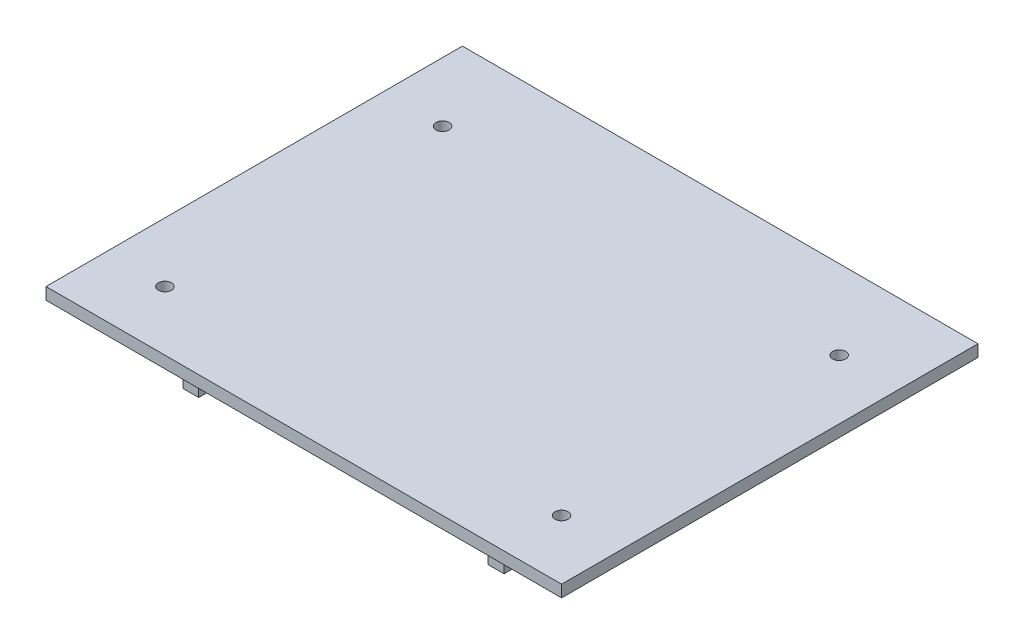
ISO-10303-21;
HEADER;
FILE_DESCRIPTION(('STEP AP214'),'2;1');
FILE_NAME('part.step','',(''),(''),'','','');
FILE_SCHEMA(('AUTOMOTIVE_DESIGN { 1 0 10303 214 1 1 1 1 }'));
ENDSEC;
DATA;
#1=APPLICATION_CONTEXT('core data for automotive mechanical design processes');
#2=APPLICATION_PROTOCOL_DEFINITION('international standard','automotive_design',2000,#1);
#3=PRODUCT_CONTEXT('',#1,'mechanical');
#4=PRODUCT('Part','Part','',(#3));
#5=PRODUCT_RELATED_PRODUCT_CATEGORY('part','',(#4));
#6=PRODUCT_DEFINITION_FORMATION('','',#4);
#7=PRODUCT_DEFINITION_CONTEXT('part definition',#1,'design');
#8=PRODUCT_DEFINITION('design','',#6,#7);
#9=PRODUCT_DEFINITION_SHAPE('','',#8);
#10=(LENGTH_UNIT() NAMED_UNIT(*) SI_UNIT(.MILLI.,.METRE.));
#11=(NAMED_UNIT(*) PLANE_ANGLE_UNIT() SI_UNIT($,.RADIAN.));
#12=(NAMED_UNIT(*) SI_UNIT($,.STERADIAN.) SOLID_ANGLE_UNIT());
#13=UNCERTAINTY_MEASURE_WITH_UNIT(LENGTH_MEASURE(1.E-05),#10,'distance_accuracy_value','');
#14=(GEOMETRIC_REPRESENTATION_CONTEXT(3) GLOBAL_UNCERTAINTY_ASSIGNED_CONTEXT((#13)) GLOBAL_UNIT_ASSIGNED_CONTEXT((#10,
#11,#12)) REPRESENTATION_CONTEXT('',''));
#15=CARTESIAN_POINT('',(0.,0.,0.));
#16=DIRECTION('',(0.,0.,1.));
#17=DIRECTION('',(1.,0.,0.));
#18=AXIS2_PLACEMENT_3D('',#15,#16,#17);
#19=CARTESIAN_POINT('',(-65.,3.,-12.));
#20=DIRECTION('',(1.,0.,0.));
#21=DIRECTION('',(0.,0.,-1.));
#22=AXIS2_PLACEMENT_3D('',#19,#20,#21);
#23=PLANE('',#22);
#24=DIRECTION('',(0.,0.,1.));
#25=VECTOR('',#24,1.);
#26=CARTESIAN_POINT('',(-65.,0.,-12.));
#27=LINE('',#26,#25);
#28=CARTESIAN_POINT('',(-65.,0.,-12.));
#29=VERTEX_POINT('',#28);
#30=CARTESIAN_POINT('',(-65.,0.,93.));
#31=VERTEX_POINT('',#30);
#32=EDGE_CURVE('E293',#29,#31,#27,.T.);
#33=ORIENTED_EDGE('',*,*,#32,.T.);
#34=DIRECTION('',(0.,-1.,0.));
#35=VECTOR('',#34,1.);
#36=CARTESIAN_POINT('',(-65.,3.,93.));
#37=LINE('',#36,#35);
#38=CARTESIAN_POINT('',(-65.,3.,93.));
#39=VERTEX_POINT('',#38);
#40=EDGE_CURVE('E379',#39,#31,#37,.T.);
#41=ORIENTED_EDGE('',*,*,#40,.F.);
#42=DIRECTION('',(0.,0.,1.));
#43=VECTOR('',#42,1.);
#44=CARTESIAN_POINT('',(-65.,3.,-12.));
#45=LINE('',#44,#43);
#46=CARTESIAN_POINT('',(-65.,3.,-12.));
#47=VERTEX_POINT('',#46);
#48=EDGE_CURVE('E345',#47,#39,#45,.T.);
#49=ORIENTED_EDGE('',*,*,#48,.F.);
#50=DIRECTION('',(0.,-1.,0.));
#51=VECTOR('',#50,1.);
#52=CARTESIAN_POINT('',(-65.,3.,-12.));
#53=LINE('',#52,#51);
#54=EDGE_CURVE('E357',#47,#29,#53,.T.);
#55=ORIENTED_EDGE('',*,*,#54,.T.);
#56=EDGE_LOOP('',(#33,#41,#49,#55));
#57=FACE_BOUND('',#56,.T.);
#58=ADVANCED_FACE('F44',(#57),#23,.F.);
#59=CARTESIAN_POINT('',(-65.,3.,93.));
#60=DIRECTION('',(0.,0.,-1.));
#61=DIRECTION('',(-1.,0.,0.));
#62=AXIS2_PLACEMENT_3D('',#59,#60,#61);
#63=PLANE('',#62);
#64=DIRECTION('',(1.,0.,0.));
#65=VECTOR('',#64,1.);
#66=CARTESIAN_POINT('',(-65.,0.,93.));
#67=LINE('',#66,#65);
#68=CARTESIAN_POINT('',(65.,0.,93.));
#69=VERTEX_POINT('',#68);
#70=EDGE_CURVE('E363',#31,#69,#67,.T.);
#71=ORIENTED_EDGE('',*,*,#70,.T.);
#72=DIRECTION('',(0.,-1.,0.));
#73=VECTOR('',#72,1.);
#74=CARTESIAN_POINT('',(65.,3.,93.));
#75=LINE('',#74,#73);
#76=CARTESIAN_POINT('',(65.,3.,93.));
#77=VERTEX_POINT('',#76);
#78=EDGE_CURVE('E376',#77,#69,#75,.T.);
#79=ORIENTED_EDGE('',*,*,#78,.F.);
#80=DIRECTION('',(1.,0.,0.));
#81=VECTOR('',#80,1.);
#82=CARTESIAN_POINT('',(-65.,3.,93.));
#83=LINE('',#82,#81);
#84=EDGE_CURVE('E350',#39,#77,#83,.T.);
#85=ORIENTED_EDGE('',*,*,#84,.F.);
#86=ORIENTED_EDGE('',*,*,#40,.T.);
#87=EDGE_LOOP('',(#71,#79,#85,#86));
#88=FACE_BOUND('',#87,.T.);
#89=ADVANCED_FACE('F426',(#88),#63,.F.);
#90=CARTESIAN_POINT('',(65.,3.,-12.));
#91=DIRECTION('',(-1.,0.,0.));
#92=DIRECTION('',(0.,0.,1.));
#93=AXIS2_PLACEMENT_3D('',#90,#91,#92);
#94=PLANE('',#93);
#95=DIRECTION('',(0.,0.,-1.));
#96=VECTOR('',#95,1.);
#97=CARTESIAN_POINT('',(65.,0.,-12.));
#98=LINE('',#97,#96);
#99=CARTESIAN_POINT('',(65.,0.,-12.));
#100=VERTEX_POINT('',#99);
#101=EDGE_CURVE('E364',#69,#100,#98,.T.);
#102=ORIENTED_EDGE('',*,*,#101,.T.);
#103=DIRECTION('',(0.,-1.,0.));
#104=VECTOR('',#103,1.);
#105=CARTESIAN_POINT('',(65.,3.,-12.));
#106=LINE('',#105,#104);
#107=CARTESIAN_POINT('',(65.,3.,-12.));
#108=VERTEX_POINT('',#107);
#109=EDGE_CURVE('E375',#108,#100,#106,.T.);
#110=ORIENTED_EDGE('',*,*,#109,.F.);
#111=DIRECTION('',(0.,0.,-1.));
#112=VECTOR('',#111,1.);
#113=CARTESIAN_POINT('',(65.,3.,-12.));
#114=LINE('',#113,#112);
#115=EDGE_CURVE('E351',#77,#108,#114,.T.);
#116=ORIENTED_EDGE('',*,*,#115,.F.);
#117=ORIENTED_EDGE('',*,*,#78,.T.);
#118=EDGE_LOOP('',(#102,#110,#116,#117));
#119=FACE_BOUND('',#118,.T.);
#120=ADVANCED_FACE('F433',(#119),#94,.F.);
#121=CARTESIAN_POINT('',(-65.,3.,-12.));
#122=DIRECTION('',(0.,0.,1.));
#123=DIRECTION('',(1.,0.,0.));
#124=AXIS2_PLACEMENT_3D('',#121,#122,#123);
#125=PLANE('',#124);
#126=DIRECTION('',(-1.,0.,0.));
#127=VECTOR('',#126,1.);
#128=CARTESIAN_POINT('',(-65.,0.,-12.));
#129=LINE('',#128,#127);
#130=EDGE_CURVE('E348',#100,#29,#129,.T.);
#131=ORIENTED_EDGE('',*,*,#130,.T.);
#132=ORIENTED_EDGE('',*,*,#54,.F.);
#133=DIRECTION('',(-1.,0.,0.));
#134=VECTOR('',#133,1.);
#135=CARTESIAN_POINT('',(-65.,3.,-12.));
#136=LINE('',#135,#134);
#137=EDGE_CURVE('E353',#108,#47,#136,.T.);
#138=ORIENTED_EDGE('',*,*,#137,.F.);
#139=ORIENTED_EDGE('',*,*,#109,.T.);
#140=EDGE_LOOP('',(#131,#132,#138,#139));
#141=FACE_BOUND('',#140,.T.);
#142=ADVANCED_FACE('F446',(#141),#125,.F.);
#143=CARTESIAN_POINT('',(0.,3.,0.));
#144=DIRECTION('',(0.,1.,0.));
#145=DIRECTION('',(0.,0.,1.));
#146=AXIS2_PLACEMENT_3D('',#143,#144,#145);
#147=PLANE('',#146);
#148=CARTESIAN_POINT('',(-50.,3.,78.));
#149=DIRECTION('',(0.,1.,0.));
#150=DIRECTION('',(0.,0.,1.));
#151=AXIS2_PLACEMENT_3D('',#148,#149,#150);
#152=CIRCLE('',#151,1.65);
#153=CARTESIAN_POINT('',(-50.,3.,79.65));
#154=VERTEX_POINT('',#153);
#155=EDGE_CURVE('E557',#154,#154,#152,.T.);
#156=ORIENTED_EDGE('',*,*,#155,.F.);
#157=EDGE_LOOP('',(#156));
#158=FACE_BOUND('',#157,.T.);
#159=CARTESIAN_POINT('',(50.,3.,8.));
#160=DIRECTION('',(0.,1.,0.));
#161=DIRECTION('',(0.,0.,1.));
#162=AXIS2_PLACEMENT_3D('',#159,#160,#161);
#163=CIRCLE('',#162,1.65);
#164=CARTESIAN_POINT('',(50.,3.,9.65));
#165=VERTEX_POINT('',#164);
#166=EDGE_CURVE('E563',#165,#165,#163,.T.);
#167=ORIENTED_EDGE('',*,*,#166,.F.);
#168=EDGE_LOOP('',(#167));
#169=FACE_BOUND('',#168,.T.);
#170=CARTESIAN_POINT('',(50.,3.,78.));
#171=DIRECTION('',(0.,1.,0.));
#172=DIRECTION('',(0.,0.,1.));
#173=AXIS2_PLACEMENT_3D('',#170,#171,#172);
#174=CIRCLE('',#173,1.65);
#175=CARTESIAN_POINT('',(50.,3.,79.65));
#176=VERTEX_POINT('',#175);
#177=EDGE_CURVE('E780',#176,#176,#174,.T.);
#178=ORIENTED_EDGE('',*,*,#177,.F.);
#179=EDGE_LOOP('',(#178));
#180=FACE_BOUND('',#179,.T.);
#181=CARTESIAN_POINT('',(-50.,3.,8.));
#182=DIRECTION('',(0.,1.,0.));
#183=DIRECTION('',(0.,0.,1.));
#184=AXIS2_PLACEMENT_3D('',#181,#182,#183);
#185=CIRCLE('',#184,1.65);
#186=CARTESIAN_POINT('',(-50.,3.,9.65));
#187=VERTEX_POINT('',#186);
#188=EDGE_CURVE('E400',#187,#187,#185,.T.);
#189=ORIENTED_EDGE('',*,*,#188,.F.);
#190=EDGE_LOOP('',(#189));
#191=FACE_BOUND('',#190,.T.);
#192=ORIENTED_EDGE('',*,*,#48,.T.);
#193=ORIENTED_EDGE('',*,*,#84,.T.);
#194=ORIENTED_EDGE('',*,*,#115,.T.);
#195=ORIENTED_EDGE('',*,*,#137,.T.);
#196=EDGE_LOOP('',(#192,#193,#194,#195));
#197=FACE_BOUND('',#196,.T.);
#198=ADVANCED_FACE('F444',(#158,#169,#180,#191,#197),#147,.T.);
#199=CARTESIAN_POINT('',(0.,0.,0.));
#200=DIRECTION('',(0.,1.,0.));
#201=DIRECTION('',(0.,0.,1.));
#202=AXIS2_PLACEMENT_3D('',#199,#200,#201);
#203=PLANE('',#202);
#204=CARTESIAN_POINT('',(-50.,0.,78.));
#205=DIRECTION('',(0.,1.,0.));
#206=DIRECTION('',(0.,0.,1.));
#207=AXIS2_PLACEMENT_3D('',#204,#205,#206);
#208=CIRCLE('',#207,1.65);
#209=CARTESIAN_POINT('',(-50.,0.,79.65));
#210=VERTEX_POINT('',#209);
#211=EDGE_CURVE('E48',#210,#210,#208,.T.);
#212=ORIENTED_EDGE('',*,*,#211,.T.);
#213=EDGE_LOOP('',(#212));
#214=FACE_BOUND('',#213,.T.);
#215=CARTESIAN_POINT('',(50.,0.,8.));
#216=DIRECTION('',(0.,1.,0.));
#217=DIRECTION('',(0.,0.,1.));
#218=AXIS2_PLACEMENT_3D('',#215,#216,#217);
#219=CIRCLE('',#218,1.65);
#220=CARTESIAN_POINT('',(50.,0.,9.65));
#221=VERTEX_POINT('',#220);
#222=EDGE_CURVE('E401',#221,#221,#219,.T.);
#223=ORIENTED_EDGE('',*,*,#222,.T.);
#224=EDGE_LOOP('',(#223));
#225=FACE_BOUND('',#224,.T.);
#226=CARTESIAN_POINT('',(50.,0.,78.));
#227=DIRECTION('',(0.,1.,0.));
#228=DIRECTION('',(0.,0.,1.));
#229=AXIS2_PLACEMENT_3D('',#226,#227,#228);
#230=CIRCLE('',#229,1.65);
#231=CARTESIAN_POINT('',(50.,0.,79.65));
#232=VERTEX_POINT('',#231);
#233=EDGE_CURVE('E398',#232,#232,#230,.T.);
#234=ORIENTED_EDGE('',*,*,#233,.T.);
#235=EDGE_LOOP('',(#234));
#236=FACE_BOUND('',#235,.T.);
#237=CARTESIAN_POINT('',(-50.,0.,8.));
#238=DIRECTION('',(0.,1.,0.));
#239=DIRECTION('',(0.,0.,1.));
#240=AXIS2_PLACEMENT_3D('',#237,#238,#239);
#241=CIRCLE('',#240,1.65);
#242=CARTESIAN_POINT('',(-50.,0.,9.65));
#243=VERTEX_POINT('',#242);
#244=EDGE_CURVE('E391',#243,#243,#241,.T.);
#245=ORIENTED_EDGE('',*,*,#244,.T.);
#246=EDGE_LOOP('',(#245));
#247=FACE_BOUND('',#246,.T.);
#248=DIRECTION('',(-1.,0.,0.));
#249=VECTOR('',#248,1.);
#250=CARTESIAN_POINT('',(-40.5,0.,-7.9999999999999));
#251=LINE('',#250,#249);
#252=CARTESIAN_POINT('',(-36.5,0.,-7.9999999999999));
#253=VERTEX_POINT('',#252);
#254=CARTESIAN_POINT('',(-40.5,0.,-7.9999999999999));
#255=VERTEX_POINT('',#254);
#256=EDGE_CURVE('E260',#253,#255,#251,.T.);
#257=ORIENTED_EDGE('',*,*,#256,.T.);
#258=DIRECTION('',(0.,0.,1.));
#259=VECTOR('',#258,1.);
#260=CARTESIAN_POINT('',(-40.5,0.,-7.9999999999999));
#261=LINE('',#260,#259);
#262=CARTESIAN_POINT('',(-40.5,0.,83.0000000000001));
#263=VERTEX_POINT('',#262);
#264=EDGE_CURVE('E272',#255,#263,#261,.T.);
#265=ORIENTED_EDGE('',*,*,#264,.T.);
#266=DIRECTION('',(1.,0.,0.));
#267=VECTOR('',#266,1.);
#268=CARTESIAN_POINT('',(-40.5,0.,83.0000000000001));
#269=LINE('',#268,#267);
#270=CARTESIAN_POINT('',(-36.5,0.,83.0000000000001));
#271=VERTEX_POINT('',#270);
#272=EDGE_CURVE('E273',#263,#271,#269,.T.);
#273=ORIENTED_EDGE('',*,*,#272,.T.);
#274=DIRECTION('',(0.,0.,-1.));
#275=VECTOR('',#274,1.);
#276=CARTESIAN_POINT('',(-36.5,0.,-7.9999999999999));
#277=LINE('',#276,#275);
#278=EDGE_CURVE('E277',#271,#253,#277,.T.);
#279=ORIENTED_EDGE('',*,*,#278,.T.);
#280=EDGE_LOOP('',(#257,#265,#273,#279));
#281=FACE_BOUND('',#280,.T.);
#282=DIRECTION('',(-1.,0.,0.));
#283=VECTOR('',#282,1.);
#284=CARTESIAN_POINT('',(36.5,0.,-8.00000000000012));
#285=LINE('',#284,#283);
#286=CARTESIAN_POINT('',(40.5,0.,-8.00000000000012));
#287=VERTEX_POINT('',#286);
#288=CARTESIAN_POINT('',(36.5,0.,-8.00000000000012));
#289=VERTEX_POINT('',#288);
#290=EDGE_CURVE('E312',#287,#289,#285,.T.);
#291=ORIENTED_EDGE('',*,*,#290,.T.);
#292=DIRECTION('',(0.,0.,1.));
#293=VECTOR('',#292,1.);
#294=CARTESIAN_POINT('',(36.5,0.,-8.00000000000012));
#295=LINE('',#294,#293);
#296=CARTESIAN_POINT('',(36.5,0.,82.9999999999999));
#297=VERTEX_POINT('',#296);
#298=EDGE_CURVE('E279',#289,#297,#295,.T.);
#299=ORIENTED_EDGE('',*,*,#298,.T.);
#300=DIRECTION('',(1.,0.,0.));
#301=VECTOR('',#300,1.);
#302=CARTESIAN_POINT('',(36.5,0.,82.9999999999999));
#303=LINE('',#302,#301);
#304=CARTESIAN_POINT('',(40.5,0.,82.9999999999999));
#305=VERTEX_POINT('',#304);
#306=EDGE_CURVE('E321',#297,#305,#303,.T.);
#307=ORIENTED_EDGE('',*,*,#306,.T.);
#308=DIRECTION('',(0.,0.,-1.));
#309=VECTOR('',#308,1.);
#310=CARTESIAN_POINT('',(40.5,0.,-8.00000000000012));
#311=LINE('',#310,#309);
#312=EDGE_CURVE('E320',#305,#287,#311,.T.);
#313=ORIENTED_EDGE('',*,*,#312,.T.);
#314=EDGE_LOOP('',(#291,#299,#307,#313));
#315=FACE_BOUND('',#314,.T.);
#316=ORIENTED_EDGE('',*,*,#32,.F.);
#317=ORIENTED_EDGE('',*,*,#130,.F.);
#318=ORIENTED_EDGE('',*,*,#101,.F.);
#319=ORIENTED_EDGE('',*,*,#70,.F.);
#320=EDGE_LOOP('',(#316,#317,#318,#319));
#321=FACE_BOUND('',#320,.T.);
#322=ADVANCED_FACE('F415',(#214,#225,#236,#247,#281,#315,#321),#203,.F.);
#323=CARTESIAN_POINT('',(36.5,-12.,-8.00000000000012));
#324=DIRECTION('',(-1.,0.,0.));
#325=DIRECTION('',(0.,0.,1.));
#326=AXIS2_PLACEMENT_3D('',#323,#324,#325);
#327=PLANE('',#326);
#328=CARTESIAN_POINT('',(36.5,-5.5,0.));
#329=DIRECTION('',(-1.,0.,0.));
#330=DIRECTION('',(0.,0.,1.));
#331=AXIS2_PLACEMENT_3D('',#328,#329,#330);
#332=CIRCLE('',#331,1.65);
#333=CARTESIAN_POINT('',(36.5,-5.5,-1.65000000000001));
#334=VERTEX_POINT('',#333);
#335=EDGE_CURVE('E247',#334,#334,#332,.T.);
#336=ORIENTED_EDGE('',*,*,#335,.F.);
#337=EDGE_LOOP('',(#336));
#338=FACE_BOUND('',#337,.T.);
#339=CARTESIAN_POINT('',(36.5,-5.5,20.48913575));
#340=DIRECTION('',(-1.,0.,0.));
#341=DIRECTION('',(0.,0.,1.));
#342=AXIS2_PLACEMENT_3D('',#339,#340,#341);
#343=CIRCLE('',#342,1.65);
#344=CARTESIAN_POINT('',(36.5,-3.85,20.48913575));
#345=VERTEX_POINT('',#344);
#346=CARTESIAN_POINT('',(36.5,-7.15,20.48913575));
#347=VERTEX_POINT('',#346);
#348=EDGE_CURVE('E190',#345,#347,#343,.T.);
#349=ORIENTED_EDGE('',*,*,#348,.F.);
#350=DIRECTION('',(0.,0.,-1.));
#351=VECTOR('',#350,1.);
#352=CARTESIAN_POINT('',(36.5,-3.85,-8.00000000000012));
#353=LINE('',#352,#351);
#354=CARTESIAN_POINT('',(36.5,-3.85,72.18913575));
#355=VERTEX_POINT('',#354);
#356=EDGE_CURVE('E222',#355,#345,#353,.T.);
#357=ORIENTED_EDGE('',*,*,#356,.F.);
#358=CARTESIAN_POINT('',(36.5,-5.5,72.18913575));
#359=DIRECTION('',(-1.,0.,0.));
#360=DIRECTION('',(0.,0.,1.));
#361=AXIS2_PLACEMENT_3D('',#358,#359,#360);
#362=CIRCLE('',#361,1.65);
#363=CARTESIAN_POINT('',(36.5,-7.15,72.18913575));
#364=VERTEX_POINT('',#363);
#365=EDGE_CURVE('E230',#364,#355,#362,.T.);
#366=ORIENTED_EDGE('',*,*,#365,.F.);
#367=DIRECTION('',(0.,0.,1.));
#368=VECTOR('',#367,1.);
#369=CARTESIAN_POINT('',(36.5,-7.15,-8.00000000000012));
#370=LINE('',#369,#368);
#371=EDGE_CURVE('E232',#347,#364,#370,.T.);
#372=ORIENTED_EDGE('',*,*,#371,.F.);
#373=EDGE_LOOP('',(#349,#357,#366,#372));
#374=FACE_BOUND('',#373,.T.);
#375=ORIENTED_EDGE('',*,*,#298,.F.);
#376=DIRECTION('',(0.,1.,0.));
#377=VECTOR('',#376,1.);
#378=CARTESIAN_POINT('',(36.5,-12.,-8.00000000000012));
#379=LINE('',#378,#377);
#380=CARTESIAN_POINT('',(36.5,-12.,-8.00000000000012));
#381=VERTEX_POINT('',#380);
#382=EDGE_CURVE('E255',#381,#289,#379,.T.);
#383=ORIENTED_EDGE('',*,*,#382,.F.);
#384=DIRECTION('',(0.,0.,1.));
#385=VECTOR('',#384,1.);
#386=CARTESIAN_POINT('',(36.5,-12.,-8.00000000000012));
#387=LINE('',#386,#385);
#388=CARTESIAN_POINT('',(36.5,-12.,82.9999999999999));
#389=VERTEX_POINT('',#388);
#390=EDGE_CURVE('E319',#381,#389,#387,.T.);
#391=ORIENTED_EDGE('',*,*,#390,.T.);
#392=DIRECTION('',(0.,1.,0.));
#393=VECTOR('',#392,1.);
#394=CARTESIAN_POINT('',(36.5,-12.,82.9999999999999));
#395=LINE('',#394,#393);
#396=EDGE_CURVE('E297',#389,#297,#395,.T.);
#397=ORIENTED_EDGE('',*,*,#396,.T.);
#398=EDGE_LOOP('',(#375,#383,#391,#397));
#399=FACE_BOUND('',#398,.T.);
#400=ADVANCED_FACE('F456',(#338,#374,#399),#327,.T.);
#401=CARTESIAN_POINT('',(36.5,-12.,-8.00000000000012));
#402=DIRECTION('',(0.,0.,-1.));
#403=DIRECTION('',(-1.,0.,0.));
#404=AXIS2_PLACEMENT_3D('',#401,#402,#403);
#405=PLANE('',#404);
#406=ORIENTED_EDGE('',*,*,#290,.F.);
#407=DIRECTION('',(0.,1.,0.));
#408=VECTOR('',#407,1.);
#409=CARTESIAN_POINT('',(40.5,-12.,-8.00000000000012));
#410=LINE('',#409,#408);
#411=CARTESIAN_POINT('',(40.5,-12.,-8.00000000000012));
#412=VERTEX_POINT('',#411);
#413=EDGE_CURVE('E310',#412,#287,#410,.T.);
#414=ORIENTED_EDGE('',*,*,#413,.F.);
#415=DIRECTION('',(-1.,0.,0.));
#416=VECTOR('',#415,1.);
#417=CARTESIAN_POINT('',(36.5,-12.,-8.00000000000012));
#418=LINE('',#417,#416);
#419=EDGE_CURVE('E303',#412,#381,#418,.T.);
#420=ORIENTED_EDGE('',*,*,#419,.T.);
#421=ORIENTED_EDGE('',*,*,#382,.T.);
#422=EDGE_LOOP('',(#406,#414,#420,#421));
#423=FACE_BOUND('',#422,.T.);
#424=ADVANCED_FACE('F468',(#423),#405,.T.);
#425=CARTESIAN_POINT('',(40.5,-12.,-8.00000000000012));
#426=DIRECTION('',(1.,0.,0.));
#427=DIRECTION('',(0.,0.,-1.));
#428=AXIS2_PLACEMENT_3D('',#425,#426,#427);
#429=PLANE('',#428);
#430=CARTESIAN_POINT('',(40.5,-5.5,0.));
#431=DIRECTION('',(1.,0.,0.));
#432=DIRECTION('',(0.,0.,-1.));
#433=AXIS2_PLACEMENT_3D('',#430,#431,#432);
#434=CIRCLE('',#433,1.65);
#435=CARTESIAN_POINT('',(40.5,-5.5,-1.65000000000001));
#436=VERTEX_POINT('',#435);
#437=EDGE_CURVE('E208',#436,#436,#434,.T.);
#438=ORIENTED_EDGE('',*,*,#437,.F.);
#439=EDGE_LOOP('',(#438));
#440=FACE_BOUND('',#439,.T.);
#441=CARTESIAN_POINT('',(40.5,-5.5,20.48913575));
#442=DIRECTION('',(1.,0.,0.));
#443=DIRECTION('',(0.,0.,-1.));
#444=AXIS2_PLACEMENT_3D('',#441,#442,#443);
#445=CIRCLE('',#444,1.65);
#446=CARTESIAN_POINT('',(40.5,-7.15,20.48913575));
#447=VERTEX_POINT('',#446);
#448=CARTESIAN_POINT('',(40.5,-3.85,20.48913575));
#449=VERTEX_POINT('',#448);
#450=EDGE_CURVE('E66',#447,#449,#445,.T.);
#451=ORIENTED_EDGE('',*,*,#450,.F.);
#452=DIRECTION('',(0.,0.,-1.));
#453=VECTOR('',#452,1.);
#454=CARTESIAN_POINT('',(40.5,-7.15,20.48913575));
#455=LINE('',#454,#453);
#456=CARTESIAN_POINT('',(40.5,-7.15,72.18913575));
#457=VERTEX_POINT('',#456);
#458=EDGE_CURVE('E193',#457,#447,#455,.T.);
#459=ORIENTED_EDGE('',*,*,#458,.F.);
#460=CARTESIAN_POINT('',(40.5,-5.5,72.18913575));
#461=DIRECTION('',(1.,0.,0.));
#462=DIRECTION('',(0.,0.,-1.));
#463=AXIS2_PLACEMENT_3D('',#460,#461,#462);
#464=CIRCLE('',#463,1.65);
#465=CARTESIAN_POINT('',(40.5,-3.85,72.18913575));
#466=VERTEX_POINT('',#465);
#467=EDGE_CURVE('E202',#466,#457,#464,.T.);
#468=ORIENTED_EDGE('',*,*,#467,.F.);
#469=DIRECTION('',(0.,0.,1.));
#470=VECTOR('',#469,1.);
#471=CARTESIAN_POINT('',(40.5,-3.85,20.48913575));
#472=LINE('',#471,#470);
#473=EDGE_CURVE('E206',#449,#466,#472,.T.);
#474=ORIENTED_EDGE('',*,*,#473,.F.);
#475=EDGE_LOOP('',(#451,#459,#468,#474));
#476=FACE_BOUND('',#475,.T.);
#477=ORIENTED_EDGE('',*,*,#312,.F.);
#478=DIRECTION('',(0.,1.,0.));
#479=VECTOR('',#478,1.);
#480=CARTESIAN_POINT('',(40.5,-12.,82.9999999999999));
#481=LINE('',#480,#479);
#482=CARTESIAN_POINT('',(40.5,-12.,82.9999999999999));
#483=VERTEX_POINT('',#482);
#484=EDGE_CURVE('E302',#483,#305,#481,.T.);
#485=ORIENTED_EDGE('',*,*,#484,.F.);
#486=DIRECTION('',(0.,0.,-1.));
#487=VECTOR('',#486,1.);
#488=CARTESIAN_POINT('',(40.5,-12.,-8.00000000000012));
#489=LINE('',#488,#487);
#490=EDGE_CURVE('E332',#483,#412,#489,.T.);
#491=ORIENTED_EDGE('',*,*,#490,.T.);
#492=ORIENTED_EDGE('',*,*,#413,.T.);
#493=EDGE_LOOP('',(#477,#485,#491,#492));
#494=FACE_BOUND('',#493,.T.);
#495=ADVANCED_FACE('F207',(#440,#476,#494),#429,.T.);
#496=CARTESIAN_POINT('',(36.5,-12.,82.9999999999999));
#497=DIRECTION('',(0.,0.,1.));
#498=DIRECTION('',(1.,0.,0.));
#499=AXIS2_PLACEMENT_3D('',#496,#497,#498);
#500=PLANE('',#499);
#501=ORIENTED_EDGE('',*,*,#306,.F.);
#502=ORIENTED_EDGE('',*,*,#396,.F.);
#503=DIRECTION('',(1.,0.,0.));
#504=VECTOR('',#503,1.);
#505=CARTESIAN_POINT('',(36.5,-12.,82.9999999999999));
#506=LINE('',#505,#504);
#507=EDGE_CURVE('E337',#389,#483,#506,.T.);
#508=ORIENTED_EDGE('',*,*,#507,.T.);
#509=ORIENTED_EDGE('',*,*,#484,.T.);
#510=EDGE_LOOP('',(#501,#502,#508,#509));
#511=FACE_BOUND('',#510,.T.);
#512=ADVANCED_FACE('F466',(#511),#500,.T.);
#513=CARTESIAN_POINT('',(0.,-12.,0.));
#514=DIRECTION('',(0.,1.,0.));
#515=DIRECTION('',(0.,0.,1.));
#516=AXIS2_PLACEMENT_3D('',#513,#514,#515);
#517=PLANE('',#516);
#518=ORIENTED_EDGE('',*,*,#390,.F.);
#519=ORIENTED_EDGE('',*,*,#419,.F.);
#520=ORIENTED_EDGE('',*,*,#490,.F.);
#521=ORIENTED_EDGE('',*,*,#507,.F.);
#522=EDGE_LOOP('',(#518,#519,#520,#521));
#523=FACE_BOUND('',#522,.T.);
#524=ADVANCED_FACE('F463',(#523),#517,.F.);
#525=CARTESIAN_POINT('',(-40.5,-12.,-7.9999999999999));
#526=DIRECTION('',(-1.,0.,0.));
#527=DIRECTION('',(0.,0.,1.));
#528=AXIS2_PLACEMENT_3D('',#525,#526,#527);
#529=PLANE('',#528);
#530=CARTESIAN_POINT('',(-40.5,-5.5,0.));
#531=DIRECTION('',(-1.,0.,0.));
#532=DIRECTION('',(0.,0.,1.));
#533=AXIS2_PLACEMENT_3D('',#530,#531,#532);
#534=CIRCLE('',#533,1.65);
#535=CARTESIAN_POINT('',(-40.5,-5.5,-1.65000000000001));
#536=VERTEX_POINT('',#535);
#537=EDGE_CURVE('E242',#536,#536,#534,.T.);
#538=ORIENTED_EDGE('',*,*,#537,.F.);
#539=EDGE_LOOP('',(#538));
#540=FACE_BOUND('',#539,.T.);
#541=CARTESIAN_POINT('',(-40.5,-5.5,20.48913575));
#542=DIRECTION('',(-1.,0.,0.));
#543=DIRECTION('',(0.,0.,1.));
#544=AXIS2_PLACEMENT_3D('',#541,#542,#543);
#545=CIRCLE('',#544,1.65);
#546=CARTESIAN_POINT('',(-40.5,-3.85,20.48913575));
#547=VERTEX_POINT('',#546);
#548=CARTESIAN_POINT('',(-40.5,-7.15,20.48913575));
#549=VERTEX_POINT('',#548);
#550=EDGE_CURVE('E238',#547,#549,#545,.T.);
#551=ORIENTED_EDGE('',*,*,#550,.F.);
#552=DIRECTION('',(0.,0.,-1.));
#553=VECTOR('',#552,1.);
#554=CARTESIAN_POINT('',(-40.5,-3.85,-7.9999999999999));
#555=LINE('',#554,#553);
#556=CARTESIAN_POINT('',(-40.5,-3.85,72.18913575));
#557=VERTEX_POINT('',#556);
#558=EDGE_CURVE('E212',#557,#547,#555,.T.);
#559=ORIENTED_EDGE('',*,*,#558,.F.);
#560=CARTESIAN_POINT('',(-40.5,-5.5,72.18913575));
#561=DIRECTION('',(-1.,0.,0.));
#562=DIRECTION('',(0.,0.,1.));
#563=AXIS2_PLACEMENT_3D('',#560,#561,#562);
#564=CIRCLE('',#563,1.65);
#565=CARTESIAN_POINT('',(-40.5,-7.15,72.18913575));
#566=VERTEX_POINT('',#565);
#567=EDGE_CURVE('E225',#566,#557,#564,.T.);
#568=ORIENTED_EDGE('',*,*,#567,.F.);
#569=DIRECTION('',(0.,0.,1.));
#570=VECTOR('',#569,1.);
#571=CARTESIAN_POINT('',(-40.5,-7.15,-7.9999999999999));
#572=LINE('',#571,#570);
#573=EDGE_CURVE('E235',#549,#566,#572,.T.);
#574=ORIENTED_EDGE('',*,*,#573,.F.);
#575=EDGE_LOOP('',(#551,#559,#568,#574));
#576=FACE_BOUND('',#575,.T.);
#577=ORIENTED_EDGE('',*,*,#264,.F.);
#578=DIRECTION('',(0.,1.,0.));
#579=VECTOR('',#578,1.);
#580=CARTESIAN_POINT('',(-40.5,-12.,-7.9999999999999));
#581=LINE('',#580,#579);
#582=CARTESIAN_POINT('',(-40.5,-12.,-7.9999999999999));
#583=VERTEX_POINT('',#582);
#584=EDGE_CURVE('E287',#583,#255,#581,.T.);
#585=ORIENTED_EDGE('',*,*,#584,.F.);
#586=DIRECTION('',(0.,0.,1.));
#587=VECTOR('',#586,1.);
#588=CARTESIAN_POINT('',(-40.5,-12.,-7.9999999999999));
#589=LINE('',#588,#587);
#590=CARTESIAN_POINT('',(-40.5,-12.,83.0000000000001));
#591=VERTEX_POINT('',#590);
#592=EDGE_CURVE('E254',#583,#591,#589,.T.);
#593=ORIENTED_EDGE('',*,*,#592,.T.);
#594=DIRECTION('',(0.,1.,0.));
#595=VECTOR('',#594,1.);
#596=CARTESIAN_POINT('',(-40.5,-12.,83.0000000000001));
#597=LINE('',#596,#595);
#598=EDGE_CURVE('E270',#591,#263,#597,.T.);
#599=ORIENTED_EDGE('',*,*,#598,.T.);
#600=EDGE_LOOP('',(#577,#585,#593,#599));
#601=FACE_BOUND('',#600,.T.);
#602=ADVANCED_FACE('F470',(#540,#576,#601),#529,.T.);
#603=CARTESIAN_POINT('',(-40.5,-12.,-7.9999999999999));
#604=DIRECTION('',(0.,0.,-1.));
#605=DIRECTION('',(-1.,0.,0.));
#606=AXIS2_PLACEMENT_3D('',#603,#604,#605);
#607=PLANE('',#606);
#608=ORIENTED_EDGE('',*,*,#256,.F.);
#609=DIRECTION('',(0.,1.,0.));
#610=VECTOR('',#609,1.);
#611=CARTESIAN_POINT('',(-36.5,-12.,-7.9999999999999));
#612=LINE('',#611,#610);
#613=CARTESIAN_POINT('',(-36.5,-12.,-7.9999999999999));
#614=VERTEX_POINT('',#613);
#615=EDGE_CURVE('E292',#614,#253,#612,.T.);
#616=ORIENTED_EDGE('',*,*,#615,.F.);
#617=DIRECTION('',(-1.,0.,0.));
#618=VECTOR('',#617,1.);
#619=CARTESIAN_POINT('',(-40.5,-12.,-7.9999999999999));
#620=LINE('',#619,#618);
#621=EDGE_CURVE('E266',#614,#583,#620,.T.);
#622=ORIENTED_EDGE('',*,*,#621,.T.);
#623=ORIENTED_EDGE('',*,*,#584,.T.);
#624=EDGE_LOOP('',(#608,#616,#622,#623));
#625=FACE_BOUND('',#624,.T.);
#626=ADVANCED_FACE('F485',(#625),#607,.T.);
#627=CARTESIAN_POINT('',(-36.5,-12.,-7.9999999999999));
#628=DIRECTION('',(1.,0.,0.));
#629=DIRECTION('',(0.,0.,-1.));
#630=AXIS2_PLACEMENT_3D('',#627,#628,#629);
#631=PLANE('',#630);
#632=CARTESIAN_POINT('',(-36.5,-5.5,0.));
#633=DIRECTION('',(1.,0.,0.));
#634=DIRECTION('',(0.,0.,-1.));
#635=AXIS2_PLACEMENT_3D('',#632,#633,#634);
#636=CIRCLE('',#635,1.65);
#637=CARTESIAN_POINT('',(-36.5,-5.5,-1.65000000000001));
#638=VERTEX_POINT('',#637);
#639=EDGE_CURVE('E243',#638,#638,#636,.T.);
#640=ORIENTED_EDGE('',*,*,#639,.F.);
#641=EDGE_LOOP('',(#640));
#642=FACE_BOUND('',#641,.T.);
#643=CARTESIAN_POINT('',(-36.5,-5.5,20.48913575));
#644=DIRECTION('',(1.,0.,0.));
#645=DIRECTION('',(0.,0.,-1.));
#646=AXIS2_PLACEMENT_3D('',#643,#644,#645);
#647=CIRCLE('',#646,1.65);
#648=CARTESIAN_POINT('',(-36.5,-7.15,20.48913575));
#649=VERTEX_POINT('',#648);
#650=CARTESIAN_POINT('',(-36.5,-3.85,20.48913575));
#651=VERTEX_POINT('',#650);
#652=EDGE_CURVE('E11',#649,#651,#647,.T.);
#653=ORIENTED_EDGE('',*,*,#652,.F.);
#654=DIRECTION('',(0.,0.,-1.));
#655=VECTOR('',#654,1.);
#656=CARTESIAN_POINT('',(-36.5,-7.15,-7.9999999999999));
#657=LINE('',#656,#655);
#658=CARTESIAN_POINT('',(-36.5,-7.15,72.18913575));
#659=VERTEX_POINT('',#658);
#660=EDGE_CURVE('E53',#659,#649,#657,.T.);
#661=ORIENTED_EDGE('',*,*,#660,.F.);
#662=CARTESIAN_POINT('',(-36.5,-5.5,72.18913575));
#663=DIRECTION('',(1.,0.,0.));
#664=DIRECTION('',(0.,0.,-1.));
#665=AXIS2_PLACEMENT_3D('',#662,#663,#664);
#666=CIRCLE('',#665,1.65);
#667=CARTESIAN_POINT('',(-36.5,-3.85,72.18913575));
#668=VERTEX_POINT('',#667);
#669=EDGE_CURVE('E386',#668,#659,#666,.T.);
#670=ORIENTED_EDGE('',*,*,#669,.F.);
#671=DIRECTION('',(0.,0.,1.));
#672=VECTOR('',#671,1.);
#673=CARTESIAN_POINT('',(-36.5,-3.85,-7.9999999999999));
#674=LINE('',#673,#672);
#675=EDGE_CURVE('E381',#651,#668,#674,.T.);
#676=ORIENTED_EDGE('',*,*,#675,.F.);
#677=EDGE_LOOP('',(#653,#661,#670,#676));
#678=FACE_BOUND('',#677,.T.);
#679=ORIENTED_EDGE('',*,*,#278,.F.);
#680=DIRECTION('',(0.,1.,0.));
#681=VECTOR('',#680,1.);
#682=CARTESIAN_POINT('',(-36.5,-12.,83.0000000000001));
#683=LINE('',#682,#681);
#684=CARTESIAN_POINT('',(-36.5,-12.,83.0000000000001));
#685=VERTEX_POINT('',#684);
#686=EDGE_CURVE('E294',#685,#271,#683,.T.);
#687=ORIENTED_EDGE('',*,*,#686,.F.);
#688=DIRECTION('',(0.,0.,-1.));
#689=VECTOR('',#688,1.);
#690=CARTESIAN_POINT('',(-36.5,-12.,-7.9999999999999));
#691=LINE('',#690,#689);
#692=EDGE_CURVE('E265',#685,#614,#691,.T.);
#693=ORIENTED_EDGE('',*,*,#692,.T.);
#694=ORIENTED_EDGE('',*,*,#615,.T.);
#695=EDGE_LOOP('',(#679,#687,#693,#694));
#696=FACE_BOUND('',#695,.T.);
#697=ADVANCED_FACE('F493',(#642,#678,#696),#631,.T.);
#698=CARTESIAN_POINT('',(-40.5,-12.,83.0000000000001));
#699=DIRECTION('',(0.,0.,1.));
#700=DIRECTION('',(1.,0.,0.));
#701=AXIS2_PLACEMENT_3D('',#698,#699,#700);
#702=PLANE('',#701);
#703=ORIENTED_EDGE('',*,*,#272,.F.);
#704=ORIENTED_EDGE('',*,*,#598,.F.);
#705=DIRECTION('',(1.,0.,0.));
#706=VECTOR('',#705,1.);
#707=CARTESIAN_POINT('',(-40.5,-12.,83.0000000000001));
#708=LINE('',#707,#706);
#709=EDGE_CURVE('E256',#591,#685,#708,.T.);
#710=ORIENTED_EDGE('',*,*,#709,.T.);
#711=ORIENTED_EDGE('',*,*,#686,.T.);
#712=EDGE_LOOP('',(#703,#704,#710,#711));
#713=FACE_BOUND('',#712,.T.);
#714=ADVANCED_FACE('F487',(#713),#702,.T.);
#715=CARTESIAN_POINT('',(0.,-12.,0.));
#716=DIRECTION('',(0.,1.,0.));
#717=DIRECTION('',(0.,0.,1.));
#718=AXIS2_PLACEMENT_3D('',#715,#716,#717);
#719=PLANE('',#718);
#720=ORIENTED_EDGE('',*,*,#592,.F.);
#721=ORIENTED_EDGE('',*,*,#621,.F.);
#722=ORIENTED_EDGE('',*,*,#692,.F.);
#723=ORIENTED_EDGE('',*,*,#709,.F.);
#724=EDGE_LOOP('',(#720,#721,#722,#723));
#725=FACE_BOUND('',#724,.T.);
#726=ADVANCED_FACE('F489',(#725),#719,.F.);
#727=CARTESIAN_POINT('',(-65.,-3.85,20.48913575));
#728=DIRECTION('',(0.,1.,0.));
#729=DIRECTION('',(0.,0.,1.));
#730=AXIS2_PLACEMENT_3D('',#727,#728,#729);
#731=PLANE('',#730);
#732=ORIENTED_EDGE('',*,*,#558,.T.);
#733=DIRECTION('',(1.,0.,0.));
#734=VECTOR('',#733,1.);
#735=CARTESIAN_POINT('',(-65.,-3.85,20.48913575));
#736=LINE('',#735,#734);
#737=EDGE_CURVE('E204',#547,#651,#736,.T.);
#738=ORIENTED_EDGE('',*,*,#737,.T.);
#739=ORIENTED_EDGE('',*,*,#675,.T.);
#740=DIRECTION('',(1.,0.,0.));
#741=VECTOR('',#740,1.);
#742=CARTESIAN_POINT('',(-65.,-3.85,72.18913575));
#743=LINE('',#742,#741);
#744=EDGE_CURVE('E569',#557,#668,#743,.T.);
#745=ORIENTED_EDGE('',*,*,#744,.F.);
#746=EDGE_LOOP('',(#732,#738,#739,#745));
#747=FACE_BOUND('',#746,.T.);
#748=ADVANCED_FACE('F501',(#747),#731,.F.);
#749=CARTESIAN_POINT('',(-65.,-5.5,72.18913575));
#750=DIRECTION('',(1.,0.,0.));
#751=DIRECTION('',(0.,0.,-1.));
#752=AXIS2_PLACEMENT_3D('',#749,#750,#751);
#753=CYLINDRICAL_SURFACE('',#752,1.65);
#754=ORIENTED_EDGE('',*,*,#567,.T.);
#755=ORIENTED_EDGE('',*,*,#744,.T.);
#756=ORIENTED_EDGE('',*,*,#669,.T.);
#757=DIRECTION('',(1.,0.,0.));
#758=VECTOR('',#757,1.);
#759=CARTESIAN_POINT('',(-65.,-7.15,72.18913575));
#760=LINE('',#759,#758);
#761=EDGE_CURVE('E572',#566,#659,#760,.T.);
#762=ORIENTED_EDGE('',*,*,#761,.F.);
#763=EDGE_LOOP('',(#754,#755,#756,#762));
#764=FACE_BOUND('',#763,.T.);
#765=ADVANCED_FACE('F510',(#764),#753,.F.);
#766=CARTESIAN_POINT('',(-65.,-7.15,20.48913575));
#767=DIRECTION('',(0.,-1.,0.));
#768=DIRECTION('',(0.,0.,-1.));
#769=AXIS2_PLACEMENT_3D('',#766,#767,#768);
#770=PLANE('',#769);
#771=ORIENTED_EDGE('',*,*,#573,.T.);
#772=ORIENTED_EDGE('',*,*,#761,.T.);
#773=ORIENTED_EDGE('',*,*,#660,.T.);
#774=DIRECTION('',(1.,0.,0.));
#775=VECTOR('',#774,1.);
#776=CARTESIAN_POINT('',(-65.,-7.15,20.48913575));
#777=LINE('',#776,#775);
#778=EDGE_CURVE('E194',#549,#649,#777,.T.);
#779=ORIENTED_EDGE('',*,*,#778,.F.);
#780=EDGE_LOOP('',(#771,#772,#773,#779));
#781=FACE_BOUND('',#780,.T.);
#782=ADVANCED_FACE('F503',(#781),#770,.F.);
#783=CARTESIAN_POINT('',(-65.,-5.5,20.48913575));
#784=DIRECTION('',(1.,0.,0.));
#785=DIRECTION('',(0.,0.,-1.));
#786=AXIS2_PLACEMENT_3D('',#783,#784,#785);
#787=CYLINDRICAL_SURFACE('',#786,1.65);
#788=ORIENTED_EDGE('',*,*,#550,.T.);
#789=ORIENTED_EDGE('',*,*,#778,.T.);
#790=ORIENTED_EDGE('',*,*,#652,.T.);
#791=ORIENTED_EDGE('',*,*,#737,.F.);
#792=EDGE_LOOP('',(#788,#789,#790,#791));
#793=FACE_BOUND('',#792,.T.);
#794=ADVANCED_FACE('F506',(#793),#787,.F.);
#795=CARTESIAN_POINT('',(-65.,-5.5,0.));
#796=DIRECTION('',(1.,0.,0.));
#797=DIRECTION('',(0.,0.,-1.));
#798=AXIS2_PLACEMENT_3D('',#795,#796,#797);
#799=CYLINDRICAL_SURFACE('',#798,1.65);
#800=CARTESIAN_POINT('',(-40.5,-5.5,-1.65000000000001));
#801=CARTESIAN_POINT('',(-40.4583333333333,-5.5,-1.65000000000001));
#802=CARTESIAN_POINT('',(-40.4166666666667,-5.5,-1.65000000000001));
#803=CARTESIAN_POINT('',(-40.3333333333333,-5.5,-1.65000000000001));
#804=CARTESIAN_POINT('',(-40.2916666666667,-5.5,-1.65000000000001));
#805=CARTESIAN_POINT('',(-40.2083333333333,-5.5,-1.65000000000001));
#806=CARTESIAN_POINT('',(-40.1666666666667,-5.5,-1.65000000000001));
#807=CARTESIAN_POINT('',(-40.0833333333333,-5.5,-1.65000000000001));
#808=CARTESIAN_POINT('',(-40.0416666666667,-5.5,-1.65000000000001));
#809=CARTESIAN_POINT('',(-39.9583333333333,-5.5,-1.65000000000001));
#810=CARTESIAN_POINT('',(-39.9166666666667,-5.5,-1.65000000000001));
#811=CARTESIAN_POINT('',(-39.8333333333333,-5.5,-1.65000000000001));
#812=CARTESIAN_POINT('',(-39.7916666666667,-5.5,-1.65000000000001));
#813=CARTESIAN_POINT('',(-39.7083333333333,-5.5,-1.65000000000001));
#814=CARTESIAN_POINT('',(-39.6666666666667,-5.5,-1.65000000000001));
#815=CARTESIAN_POINT('',(-39.5833333333333,-5.5,-1.65000000000001));
#816=CARTESIAN_POINT('',(-39.5416666666667,-5.5,-1.65000000000001));
#817=CARTESIAN_POINT('',(-39.4583333333333,-5.5,-1.65000000000001));
#818=CARTESIAN_POINT('',(-39.4166666666667,-5.5,-1.65000000000001));
#819=CARTESIAN_POINT('',(-39.3333333333333,-5.5,-1.65000000000001));
#820=CARTESIAN_POINT('',(-39.2916666666667,-5.5,-1.65000000000001));
#821=CARTESIAN_POINT('',(-39.2083333333333,-5.5,-1.65000000000001));
#822=CARTESIAN_POINT('',(-39.1666666666667,-5.5,-1.65000000000001));
#823=CARTESIAN_POINT('',(-39.0833333333333,-5.5,-1.65000000000001));
#824=CARTESIAN_POINT('',(-39.0416666666667,-5.5,-1.65000000000001));
#825=CARTESIAN_POINT('',(-38.9583333333333,-5.5,-1.65000000000001));
#826=CARTESIAN_POINT('',(-38.9166666666667,-5.5,-1.65000000000001));
#827=CARTESIAN_POINT('',(-38.8333333333333,-5.5,-1.65000000000001));
#828=CARTESIAN_POINT('',(-38.7916666666667,-5.5,-1.65000000000001));
#829=CARTESIAN_POINT('',(-38.7083333333333,-5.5,-1.65000000000001));
#830=CARTESIAN_POINT('',(-38.6666666666667,-5.5,-1.65000000000001));
#831=CARTESIAN_POINT('',(-38.5833333333333,-5.5,-1.65000000000001));
#832=CARTESIAN_POINT('',(-38.5416666666667,-5.5,-1.65000000000001));
#833=CARTESIAN_POINT('',(-38.4583333333333,-5.5,-1.65000000000001));
#834=CARTESIAN_POINT('',(-38.4166666666667,-5.5,-1.65000000000001));
#835=CARTESIAN_POINT('',(-38.3333333333333,-5.5,-1.65000000000001));
#836=CARTESIAN_POINT('',(-38.2916666666667,-5.5,-1.65000000000001));
#837=CARTESIAN_POINT('',(-38.2083333333333,-5.5,-1.65000000000001));
#838=CARTESIAN_POINT('',(-38.1666666666667,-5.5,-1.65000000000001));
#839=CARTESIAN_POINT('',(-38.0833333333333,-5.5,-1.65000000000001));
#840=CARTESIAN_POINT('',(-38.0416666666667,-5.5,-1.65000000000001));
#841=CARTESIAN_POINT('',(-37.9583333333333,-5.5,-1.65000000000001));
#842=CARTESIAN_POINT('',(-37.9166666666667,-5.5,-1.65000000000001));
#843=CARTESIAN_POINT('',(-37.8333333333333,-5.5,-1.65000000000001));
#844=CARTESIAN_POINT('',(-37.7916666666667,-5.5,-1.65000000000001));
#845=CARTESIAN_POINT('',(-37.7083333333333,-5.5,-1.65000000000001));
#846=CARTESIAN_POINT('',(-37.6666666666667,-5.5,-1.65000000000001));
#847=CARTESIAN_POINT('',(-37.5833333333333,-5.5,-1.65000000000001));
#848=CARTESIAN_POINT('',(-37.5416666666667,-5.5,-1.65000000000001));
#849=CARTESIAN_POINT('',(-37.4583333333333,-5.5,-1.65000000000001));
#850=CARTESIAN_POINT('',(-37.4166666666667,-5.5,-1.65000000000001));
#851=CARTESIAN_POINT('',(-37.3333333333333,-5.5,-1.65000000000001));
#852=CARTESIAN_POINT('',(-37.2916666666667,-5.5,-1.65000000000001));
#853=CARTESIAN_POINT('',(-37.2083333333333,-5.5,-1.65000000000001));
#854=CARTESIAN_POINT('',(-37.1666666666667,-5.5,-1.65000000000001));
#855=CARTESIAN_POINT('',(-37.0833333333333,-5.5,-1.65000000000001));
#856=CARTESIAN_POINT('',(-37.0416666666667,-5.5,-1.65000000000001));
#857=CARTESIAN_POINT('',(-36.9583333333333,-5.5,-1.65000000000001));
#858=CARTESIAN_POINT('',(-36.9166666666667,-5.5,-1.65000000000001));
#859=CARTESIAN_POINT('',(-36.8333333333333,-5.5,-1.65000000000001));
#860=CARTESIAN_POINT('',(-36.7916666666667,-5.5,-1.65000000000001));
#861=CARTESIAN_POINT('',(-36.7083333333333,-5.5,-1.65000000000001));
#862=CARTESIAN_POINT('',(-36.6666666666667,-5.5,-1.65000000000001));
#863=CARTESIAN_POINT('',(-36.5833333333333,-5.5,-1.65000000000001));
#864=CARTESIAN_POINT('',(-36.5416666666667,-5.5,-1.65000000000001));
#865=CARTESIAN_POINT('',(-36.5,-5.5,-1.65000000000001));
#866=B_SPLINE_CURVE_WITH_KNOTS('',3,(#800,#801,#802,#803,#804,#805,#806,#807,#808,#809,#810,
#811,#812,#813,#814,#815,#816,#817,#818,#819,#820,#821,#822,#823,#824,#825,#826,#827,#828,#829,
#830,#831,#832,#833,#834,#835,#836,#837,#838,#839,#840,#841,#842,#843,#844,#845,#846,#847,#848,
#849,#850,#851,#852,#853,#854,#855,#856,#857,#858,#859,#860,#861,#862,#863,#864,#865),
.UNSPECIFIED.,.F.,.F.,(4,2,2,2,2,2,2,2,2,2,2,2,2,2,2,2,2,2,2,2,2,2,2,2,2,2,2,2,2,2,2,2,4),(0.,
0.125,0.25,0.375,0.5,0.625000000000001,0.750000000000001,0.875000000000001,1.,1.125,1.25,1.375,
1.5,1.625,1.75,1.875,2.,2.125,2.25,2.375,2.5,2.625,2.75,2.875,3.,3.125,3.25,3.375,3.5,3.625,
3.75,3.875,4.),.UNSPECIFIED.);
#867=EDGE_CURVE('BSEAM518',#536,#638,#866,.T.);
#868=ORIENTED_EDGE('',*,*,#537,.T.);
#869=ORIENTED_EDGE('',*,*,#639,.T.);
#870=ORIENTED_EDGE('',*,*,#867,.T.);
#871=ORIENTED_EDGE('',*,*,#867,.F.);
#872=EDGE_LOOP('',(#868,#870,#869,#871));
#873=FACE_BOUND('',#872,.T.);
#874=ADVANCED_FACE('F518',(#873),#799,.F.);
#875=ORIENTED_EDGE('',*,*,#348,.T.);
#876=EDGE_CURVE('E182',#347,#447,#777,.T.);
#877=ORIENTED_EDGE('',*,*,#876,.T.);
#878=ORIENTED_EDGE('',*,*,#450,.T.);
#879=EDGE_CURVE('E570',#345,#449,#736,.T.);
#880=ORIENTED_EDGE('',*,*,#879,.F.);
#881=EDGE_LOOP('',(#875,#877,#878,#880));
#882=FACE_BOUND('',#881,.T.);
#883=ADVANCED_FACE('F184',(#882),#787,.F.);
#884=ORIENTED_EDGE('',*,*,#371,.T.);
#885=EDGE_CURVE('E200',#364,#457,#760,.T.);
#886=ORIENTED_EDGE('',*,*,#885,.T.);
#887=ORIENTED_EDGE('',*,*,#458,.T.);
#888=ORIENTED_EDGE('',*,*,#876,.F.);
#889=EDGE_LOOP('',(#884,#886,#887,#888));
#890=FACE_BOUND('',#889,.T.);
#891=ADVANCED_FACE('F192',(#890),#770,.F.);
#892=ORIENTED_EDGE('',*,*,#365,.T.);
#893=EDGE_CURVE('E61',#355,#466,#743,.T.);
#894=ORIENTED_EDGE('',*,*,#893,.T.);
#895=ORIENTED_EDGE('',*,*,#467,.T.);
#896=ORIENTED_EDGE('',*,*,#885,.F.);
#897=EDGE_LOOP('',(#892,#894,#895,#896));
#898=FACE_BOUND('',#897,.T.);
#899=ADVANCED_FACE('F515',(#898),#753,.F.);
#900=ORIENTED_EDGE('',*,*,#356,.T.);
#901=ORIENTED_EDGE('',*,*,#879,.T.);
#902=ORIENTED_EDGE('',*,*,#473,.T.);
#903=ORIENTED_EDGE('',*,*,#893,.F.);
#904=EDGE_LOOP('',(#900,#901,#902,#903));
#905=FACE_BOUND('',#904,.T.);
#906=ADVANCED_FACE('F519',(#905),#731,.F.);
#907=CARTESIAN_POINT('',(36.5,-5.5,-1.65000000000001));
#908=CARTESIAN_POINT('',(36.5416666666667,-5.5,-1.65000000000001));
#909=CARTESIAN_POINT('',(36.5833333333333,-5.5,-1.65000000000001));
#910=CARTESIAN_POINT('',(36.6666666666667,-5.5,-1.65000000000001));
#911=CARTESIAN_POINT('',(36.7083333333333,-5.5,-1.65000000000001));
#912=CARTESIAN_POINT('',(36.7916666666667,-5.5,-1.65000000000001));
#913=CARTESIAN_POINT('',(36.8333333333333,-5.5,-1.65000000000001));
#914=CARTESIAN_POINT('',(36.9166666666667,-5.5,-1.65000000000001));
#915=CARTESIAN_POINT('',(36.9583333333333,-5.5,-1.65000000000001));
#916=CARTESIAN_POINT('',(37.0416666666667,-5.5,-1.65000000000001));
#917=CARTESIAN_POINT('',(37.0833333333333,-5.5,-1.65000000000001));
#918=CARTESIAN_POINT('',(37.1666666666667,-5.5,-1.65000000000001));
#919=CARTESIAN_POINT('',(37.2083333333333,-5.5,-1.65000000000001));
#920=CARTESIAN_POINT('',(37.2916666666667,-5.5,-1.65000000000001));
#921=CARTESIAN_POINT('',(37.3333333333333,-5.5,-1.65000000000001));
#922=CARTESIAN_POINT('',(37.4166666666667,-5.5,-1.65000000000001));
#923=CARTESIAN_POINT('',(37.4583333333333,-5.5,-1.65000000000001));
#924=CARTESIAN_POINT('',(37.5416666666667,-5.5,-1.65000000000001));
#925=CARTESIAN_POINT('',(37.5833333333333,-5.5,-1.65000000000001));
#926=CARTESIAN_POINT('',(37.6666666666667,-5.5,-1.65000000000001));
#927=CARTESIAN_POINT('',(37.7083333333333,-5.5,-1.65000000000001));
#928=CARTESIAN_POINT('',(37.7916666666667,-5.5,-1.65000000000001));
#929=CARTESIAN_POINT('',(37.8333333333333,-5.5,-1.65000000000001));
#930=CARTESIAN_POINT('',(37.9166666666667,-5.5,-1.65000000000001));
#931=CARTESIAN_POINT('',(37.9583333333333,-5.5,-1.65000000000001));
#932=CARTESIAN_POINT('',(38.0416666666667,-5.5,-1.65000000000001));
#933=CARTESIAN_POINT('',(38.0833333333333,-5.5,-1.65000000000001));
#934=CARTESIAN_POINT('',(38.1666666666667,-5.5,-1.65000000000001));
#935=CARTESIAN_POINT('',(38.2083333333333,-5.5,-1.65000000000001));
#936=CARTESIAN_POINT('',(38.2916666666667,-5.5,-1.65000000000001));
#937=CARTESIAN_POINT('',(38.3333333333333,-5.5,-1.65000000000001));
#938=CARTESIAN_POINT('',(38.4166666666667,-5.5,-1.65000000000001));
#939=CARTESIAN_POINT('',(38.4583333333333,-5.5,-1.65000000000001));
#940=CARTESIAN_POINT('',(38.5416666666667,-5.5,-1.65000000000001));
#941=CARTESIAN_POINT('',(38.5833333333333,-5.5,-1.65000000000001));
#942=CARTESIAN_POINT('',(38.6666666666667,-5.5,-1.65000000000001));
#943=CARTESIAN_POINT('',(38.7083333333333,-5.5,-1.65000000000001));
#944=CARTESIAN_POINT('',(38.7916666666667,-5.5,-1.65000000000001));
#945=CARTESIAN_POINT('',(38.8333333333333,-5.5,-1.65000000000001));
#946=CARTESIAN_POINT('',(38.9166666666667,-5.5,-1.65000000000001));
#947=CARTESIAN_POINT('',(38.9583333333333,-5.5,-1.65000000000001));
#948=CARTESIAN_POINT('',(39.0416666666667,-5.5,-1.65000000000001));
#949=CARTESIAN_POINT('',(39.0833333333333,-5.5,-1.65000000000001));
#950=CARTESIAN_POINT('',(39.1666666666667,-5.5,-1.65000000000001));
#951=CARTESIAN_POINT('',(39.2083333333333,-5.5,-1.65000000000001));
#952=CARTESIAN_POINT('',(39.2916666666667,-5.5,-1.65000000000001));
#953=CARTESIAN_POINT('',(39.3333333333333,-5.5,-1.65000000000001));
#954=CARTESIAN_POINT('',(39.4166666666667,-5.5,-1.65000000000001));
#955=CARTESIAN_POINT('',(39.4583333333333,-5.5,-1.65000000000001));
#956=CARTESIAN_POINT('',(39.5416666666667,-5.5,-1.65000000000001));
#957=CARTESIAN_POINT('',(39.5833333333333,-5.5,-1.65000000000001));
#958=CARTESIAN_POINT('',(39.6666666666667,-5.5,-1.65000000000001));
#959=CARTESIAN_POINT('',(39.7083333333333,-5.5,-1.65000000000001));
#960=CARTESIAN_POINT('',(39.7916666666667,-5.5,-1.65000000000001));
#961=CARTESIAN_POINT('',(39.8333333333333,-5.5,-1.65000000000001));
#962=CARTESIAN_POINT('',(39.9166666666667,-5.5,-1.65000000000001));
#963=CARTESIAN_POINT('',(39.9583333333333,-5.5,-1.65000000000001));
#964=CARTESIAN_POINT('',(40.0416666666667,-5.5,-1.65000000000001));
#965=CARTESIAN_POINT('',(40.0833333333333,-5.5,-1.65000000000001));
#966=CARTESIAN_POINT('',(40.1666666666667,-5.5,-1.65000000000001));
#967=CARTESIAN_POINT('',(40.2083333333333,-5.5,-1.65000000000001));
#968=CARTESIAN_POINT('',(40.2916666666667,-5.5,-1.65000000000001));
#969=CARTESIAN_POINT('',(40.3333333333333,-5.5,-1.65000000000001));
#970=CARTESIAN_POINT('',(40.4166666666667,-5.5,-1.65000000000001));
#971=CARTESIAN_POINT('',(40.4583333333333,-5.5,-1.65000000000001));
#972=CARTESIAN_POINT('',(40.5,-5.5,-1.65000000000001));
#973=B_SPLINE_CURVE_WITH_KNOTS('',3,(#907,#908,#909,#910,#911,#912,#913,#914,#915,#916,#917,
#918,#919,#920,#921,#922,#923,#924,#925,#926,#927,#928,#929,#930,#931,#932,#933,#934,#935,#936,
#937,#938,#939,#940,#941,#942,#943,#944,#945,#946,#947,#948,#949,#950,#951,#952,#953,#954,#955,
#956,#957,#958,#959,#960,#961,#962,#963,#964,#965,#966,#967,#968,#969,#970,#971,#972),
.UNSPECIFIED.,.F.,.F.,(4,2,2,2,2,2,2,2,2,2,2,2,2,2,2,2,2,2,2,2,2,2,2,2,2,2,2,2,2,2,2,2,4),(0.,
0.125,0.25,0.375,0.5,0.625000000000001,0.750000000000001,0.875000000000001,1.,1.125,1.25,1.375,
1.5,1.625,1.75,1.875,2.,2.125,2.25,2.375,2.5,2.625,2.75,2.875,3.,3.125,3.25,3.375,3.5,3.625,
3.75,3.875,4.),.UNSPECIFIED.);
#974=EDGE_CURVE('BSEAM524',#334,#436,#973,.T.);
#975=ORIENTED_EDGE('',*,*,#335,.T.);
#976=ORIENTED_EDGE('',*,*,#437,.T.);
#977=ORIENTED_EDGE('',*,*,#974,.T.);
#978=ORIENTED_EDGE('',*,*,#974,.F.);
#979=EDGE_LOOP('',(#975,#977,#976,#978));
#980=FACE_BOUND('',#979,.T.);
#981=ADVANCED_FACE('F524',(#980),#799,.F.);
#982=CARTESIAN_POINT('',(-50.,-12.,8.));
#983=DIRECTION('',(0.,1.,0.));
#984=DIRECTION('',(0.,0.,1.));
#985=AXIS2_PLACEMENT_3D('',#982,#983,#984);
#986=CYLINDRICAL_SURFACE('',#985,1.65);
#987=ORIENTED_EDGE('',*,*,#188,.T.);
#988=EDGE_LOOP('',(#987));
#989=FACE_BOUND('',#988,.T.);
#990=ORIENTED_EDGE('',*,*,#244,.F.);
#991=EDGE_LOOP('',(#990));
#992=FACE_BOUND('',#991,.T.);
#993=ADVANCED_FACE('F521',(#989,#992),#986,.F.);
#994=CARTESIAN_POINT('',(50.,-12.,78.));
#995=DIRECTION('',(0.,1.,0.));
#996=DIRECTION('',(0.,0.,1.));
#997=AXIS2_PLACEMENT_3D('',#994,#995,#996);
#998=CYLINDRICAL_SURFACE('',#997,1.65);
#999=ORIENTED_EDGE('',*,*,#177,.T.);
#1000=EDGE_LOOP('',(#999));
#1001=FACE_BOUND('',#1000,.T.);
#1002=ORIENTED_EDGE('',*,*,#233,.F.);
#1003=EDGE_LOOP('',(#1002));
#1004=FACE_BOUND('',#1003,.T.);
#1005=ADVANCED_FACE('F422',(#1001,#1004),#998,.F.);
#1006=CARTESIAN_POINT('',(50.,-12.,8.));
#1007=DIRECTION('',(0.,1.,0.));
#1008=DIRECTION('',(0.,0.,1.));
#1009=AXIS2_PLACEMENT_3D('',#1006,#1007,#1008);
#1010=CYLINDRICAL_SURFACE('',#1009,1.65);
#1011=ORIENTED_EDGE('',*,*,#166,.T.);
#1012=EDGE_LOOP('',(#1011));
#1013=FACE_BOUND('',#1012,.T.);
#1014=ORIENTED_EDGE('',*,*,#222,.F.);
#1015=EDGE_LOOP('',(#1014));
#1016=FACE_BOUND('',#1015,.T.);
#1017=ADVANCED_FACE('F416',(#1013,#1016),#1010,.F.);
#1018=CARTESIAN_POINT('',(-50.,-12.,78.));
#1019=DIRECTION('',(0.,1.,0.));
#1020=DIRECTION('',(0.,0.,1.));
#1021=AXIS2_PLACEMENT_3D('',#1018,#1019,#1020);
#1022=CYLINDRICAL_SURFACE('',#1021,1.65);
#1023=ORIENTED_EDGE('',*,*,#155,.T.);
#1024=EDGE_LOOP('',(#1023));
#1025=FACE_BOUND('',#1024,.T.);
#1026=ORIENTED_EDGE('',*,*,#211,.F.);
#1027=EDGE_LOOP('',(#1026));
#1028=FACE_BOUND('',#1027,.T.);
#1029=ADVANCED_FACE('F414',(#1025,#1028),#1022,.F.);
#1030=CLOSED_SHELL('',(#58,#89,#120,#142,#198,#322,#400,#424,#495,#512,#524,#602,#626,#697,#714,
#726,#748,#765,#782,#794,#874,#883,#891,#899,#906,#981,#993,#1005,#1017,#1029));
#1031=MANIFOLD_SOLID_BREP('B2',#1030);
#1032=ADVANCED_BREP_SHAPE_REPRESENTATION('',(#18,#1031),#14);
#1033=SHAPE_DEFINITION_REPRESENTATION(#9,#1032);
ENDSEC;
END-ISO-10303-21;
